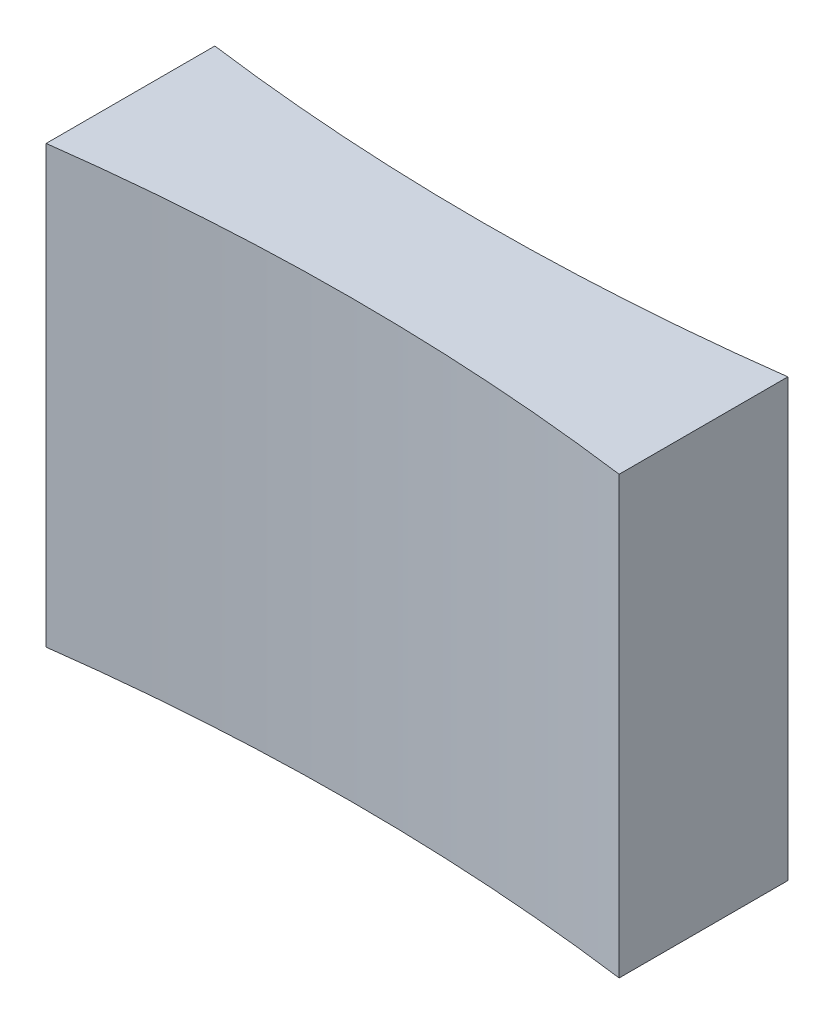
ISO-10303-21;
HEADER;
FILE_DESCRIPTION(('STEP AP214'),'2;1');
FILE_NAME('part.step','',(''),(''),'','','');
FILE_SCHEMA(('AUTOMOTIVE_DESIGN { 1 0 10303 214 1 1 1 1 }'));
ENDSEC;
DATA;
#1=APPLICATION_CONTEXT('core data for automotive mechanical design processes');
#2=APPLICATION_PROTOCOL_DEFINITION('international standard','automotive_design',2000,#1);
#3=PRODUCT_CONTEXT('',#1,'mechanical');
#4=PRODUCT('Part','Part','',(#3));
#5=PRODUCT_RELATED_PRODUCT_CATEGORY('part','',(#4));
#6=PRODUCT_DEFINITION_FORMATION('','',#4);
#7=PRODUCT_DEFINITION_CONTEXT('part definition',#1,'design');
#8=PRODUCT_DEFINITION('design','',#6,#7);
#9=PRODUCT_DEFINITION_SHAPE('','',#8);
#10=(LENGTH_UNIT() NAMED_UNIT(*) SI_UNIT(.MILLI.,.METRE.));
#11=(NAMED_UNIT(*) PLANE_ANGLE_UNIT() SI_UNIT($,.RADIAN.));
#12=(NAMED_UNIT(*) SI_UNIT($,.STERADIAN.) SOLID_ANGLE_UNIT());
#13=UNCERTAINTY_MEASURE_WITH_UNIT(LENGTH_MEASURE(1.E-05),#10,'distance_accuracy_value','');
#14=(GEOMETRIC_REPRESENTATION_CONTEXT(3) GLOBAL_UNCERTAINTY_ASSIGNED_CONTEXT((#13)) GLOBAL_UNIT_ASSIGNED_CONTEXT((#10,
#11,#12)) REPRESENTATION_CONTEXT('',''));
#15=CARTESIAN_POINT('',(0.,0.,0.));
#16=DIRECTION('',(0.,0.,1.));
#17=DIRECTION('',(1.,0.,0.));
#18=AXIS2_PLACEMENT_3D('',#15,#16,#17);
#19=CARTESIAN_POINT('',(-1.66533453693773E-13,9.,-102.907430787315));
#20=DIRECTION('',(0.,-1.,0.));
#21=DIRECTION('',(0.,0.,-1.));
#22=AXIS2_PLACEMENT_3D('',#19,#20,#21);
#23=CYLINDRICAL_SURFACE('',#22,99.9074307873154);
#24=CARTESIAN_POINT('',(-1.66533453693773E-13,0.,-102.907430787315));
#25=DIRECTION('',(0.,1.,0.));
#26=DIRECTION('',(0.,0.,1.));
#27=AXIS2_PLACEMENT_3D('',#24,#25,#26);
#28=CIRCLE('',#27,99.9074307873154);
#29=CARTESIAN_POINT('',(-13.1344064930465,0.,-3.86712539300816));
#30=VERTEX_POINT('',#29);
#31=CARTESIAN_POINT('',(13.1344064930464,0.,-3.86712539300819));
#32=VERTEX_POINT('',#31);
#33=EDGE_CURVE('E178',#30,#32,#28,.T.);
#34=ORIENTED_EDGE('',*,*,#33,.F.);
#35=DIRECTION('',(0.,-1.,0.));
#36=VECTOR('',#35,1.);
#37=CARTESIAN_POINT('',(-13.1344064930465,9.,-3.86712539300816));
#38=LINE('',#37,#36);
#39=CARTESIAN_POINT('',(-13.1344064930465,20.,-3.86712539300816));
#40=VERTEX_POINT('',#39);
#41=EDGE_CURVE('E11',#40,#30,#38,.T.);
#42=ORIENTED_EDGE('',*,*,#41,.F.);
#43=CARTESIAN_POINT('',(-1.66533453693773E-13,20.,-102.907430787315));
#44=DIRECTION('',(0.,1.,0.));
#45=DIRECTION('',(0.,0.,1.));
#46=AXIS2_PLACEMENT_3D('',#43,#44,#45);
#47=CIRCLE('',#46,99.9074307873154);
#48=CARTESIAN_POINT('',(13.1344064930464,20.,-3.86712539300819));
#49=VERTEX_POINT('',#48);
#50=EDGE_CURVE('E166',#49,#40,#47,.F.);
#51=ORIENTED_EDGE('',*,*,#50,.F.);
#52=DIRECTION('',(0.,-1.,0.));
#53=VECTOR('',#52,1.);
#54=CARTESIAN_POINT('',(13.1344064930464,9.,-3.86712539300819));
#55=LINE('',#54,#53);
#56=EDGE_CURVE('E70',#49,#32,#55,.T.);
#57=ORIENTED_EDGE('',*,*,#56,.T.);
#58=EDGE_LOOP('',(#34,#42,#51,#57));
#59=FACE_BOUND('',#58,.T.);
#60=ADVANCED_FACE('F47',(#59),#23,.F.);
#61=CARTESIAN_POINT('',(-13.1344064930464,9.,1.73809884253372E-13));
#62=DIRECTION('',(1.,0.,0.));
#63=DIRECTION('',(0.,0.,-1.));
#64=AXIS2_PLACEMENT_3D('',#61,#62,#63);
#65=PLANE('',#64);
#66=DIRECTION('',(0.,0.,1.));
#67=VECTOR('',#66,1.);
#68=CARTESIAN_POINT('',(-13.1344064930464,0.,1.73809884253372E-13));
#69=LINE('',#68,#67);
#70=CARTESIAN_POINT('',(-13.1344064930464,0.,3.86712539300834));
#71=VERTEX_POINT('',#70);
#72=EDGE_CURVE('E182',#30,#71,#69,.T.);
#73=ORIENTED_EDGE('',*,*,#72,.T.);
#74=DIRECTION('',(0.,-1.,0.));
#75=VECTOR('',#74,1.);
#76=CARTESIAN_POINT('',(-13.1344064930464,9.,3.86712539300834));
#77=LINE('',#76,#75);
#78=CARTESIAN_POINT('',(-13.1344064930464,20.,3.86712539300835));
#79=VERTEX_POINT('',#78);
#80=EDGE_CURVE('E55',#79,#71,#77,.T.);
#81=ORIENTED_EDGE('',*,*,#80,.F.);
#82=DIRECTION('',(0.,0.,1.));
#83=VECTOR('',#82,1.);
#84=CARTESIAN_POINT('',(-13.1344064930464,20.,1.73809884253372E-13));
#85=LINE('',#84,#83);
#86=EDGE_CURVE('E170',#40,#79,#85,.T.);
#87=ORIENTED_EDGE('',*,*,#86,.F.);
#88=ORIENTED_EDGE('',*,*,#41,.T.);
#89=EDGE_LOOP('',(#73,#81,#87,#88));
#90=FACE_BOUND('',#89,.T.);
#91=ADVANCED_FACE('F205',(#90),#65,.F.);
#92=CARTESIAN_POINT('',(-1.31838984174237E-13,9.,102.907430787315));
#93=DIRECTION('',(0.,-1.,0.));
#94=DIRECTION('',(0.,0.,-1.));
#95=AXIS2_PLACEMENT_3D('',#92,#93,#94);
#96=CYLINDRICAL_SURFACE('',#95,99.9074307873151);
#97=CARTESIAN_POINT('',(-1.31838984174237E-13,0.,102.907430787315));
#98=DIRECTION('',(0.,1.,0.));
#99=DIRECTION('',(0.,0.,1.));
#100=AXIS2_PLACEMENT_3D('',#97,#98,#99);
#101=CIRCLE('',#100,99.9074307873151);
#102=CARTESIAN_POINT('',(13.1344064930462,0.,3.86712539300835));
#103=VERTEX_POINT('',#102);
#104=EDGE_CURVE('E186',#103,#71,#101,.T.);
#105=ORIENTED_EDGE('',*,*,#104,.F.);
#106=DIRECTION('',(0.,-1.,0.));
#107=VECTOR('',#106,1.);
#108=CARTESIAN_POINT('',(13.1344064930462,9.,3.86712539300835));
#109=LINE('',#108,#107);
#110=CARTESIAN_POINT('',(13.1344064930462,20.,3.86712539300835));
#111=VERTEX_POINT('',#110);
#112=EDGE_CURVE('E195',#111,#103,#109,.T.);
#113=ORIENTED_EDGE('',*,*,#112,.F.);
#114=CARTESIAN_POINT('',(-1.31838984174237E-13,20.,102.907430787315));
#115=DIRECTION('',(0.,1.,0.));
#116=DIRECTION('',(0.,0.,1.));
#117=AXIS2_PLACEMENT_3D('',#114,#115,#116);
#118=CIRCLE('',#117,99.9074307873151);
#119=EDGE_CURVE('E174',#79,#111,#118,.F.);
#120=ORIENTED_EDGE('',*,*,#119,.F.);
#121=ORIENTED_EDGE('',*,*,#80,.T.);
#122=EDGE_LOOP('',(#105,#113,#120,#121));
#123=FACE_BOUND('',#122,.T.);
#124=ADVANCED_FACE('F201',(#123),#96,.F.);
#125=CARTESIAN_POINT('',(13.1344064930463,9.,2.71025582225593E-13));
#126=DIRECTION('',(-1.,0.,0.));
#127=DIRECTION('',(0.,0.,1.));
#128=AXIS2_PLACEMENT_3D('',#125,#126,#127);
#129=PLANE('',#128);
#130=DIRECTION('',(0.,0.,-1.));
#131=VECTOR('',#130,1.);
#132=CARTESIAN_POINT('',(13.1344064930463,0.,2.71025582225593E-13));
#133=LINE('',#132,#131);
#134=EDGE_CURVE('E190',#103,#32,#133,.T.);
#135=ORIENTED_EDGE('',*,*,#134,.T.);
#136=ORIENTED_EDGE('',*,*,#56,.F.);
#137=DIRECTION('',(0.,0.,-1.));
#138=VECTOR('',#137,1.);
#139=CARTESIAN_POINT('',(13.1344064930463,20.,2.71025582225593E-13));
#140=LINE('',#139,#138);
#141=EDGE_CURVE('E157',#111,#49,#140,.T.);
#142=ORIENTED_EDGE('',*,*,#141,.F.);
#143=ORIENTED_EDGE('',*,*,#112,.T.);
#144=EDGE_LOOP('',(#135,#136,#142,#143));
#145=FACE_BOUND('',#144,.T.);
#146=ADVANCED_FACE('F210',(#145),#129,.F.);
#147=CARTESIAN_POINT('',(0.,0.,0.));
#148=DIRECTION('',(0.,1.,0.));
#149=DIRECTION('',(0.,0.,1.));
#150=AXIS2_PLACEMENT_3D('',#147,#148,#149);
#151=PLANE('',#150);
#152=DIRECTION('',(1.,0.,0.));
#153=VECTOR('',#152,1.);
#154=CARTESIAN_POINT('',(-7.5,0.,-2.5));
#155=LINE('',#154,#153);
#156=CARTESIAN_POINT('',(-7.5,0.,-2.5));
#157=VERTEX_POINT('',#156);
#158=CARTESIAN_POINT('',(7.5,0.,-2.5));
#159=VERTEX_POINT('',#158);
#160=EDGE_CURVE('E148',#157,#159,#155,.T.);
#161=ORIENTED_EDGE('',*,*,#160,.F.);
#162=DIRECTION('',(0.,0.,-1.));
#163=VECTOR('',#162,1.);
#164=CARTESIAN_POINT('',(-7.5,0.,2.5));
#165=LINE('',#164,#163);
#166=CARTESIAN_POINT('',(-7.5,0.,2.5));
#167=VERTEX_POINT('',#166);
#168=EDGE_CURVE('E62',#167,#157,#165,.T.);
#169=ORIENTED_EDGE('',*,*,#168,.F.);
#170=DIRECTION('',(-1.,0.,0.));
#171=VECTOR('',#170,1.);
#172=CARTESIAN_POINT('',(-7.5,0.,2.5));
#173=LINE('',#172,#171);
#174=CARTESIAN_POINT('',(7.5,0.,2.5));
#175=VERTEX_POINT('',#174);
#176=EDGE_CURVE('E135',#175,#167,#173,.T.);
#177=ORIENTED_EDGE('',*,*,#176,.F.);
#178=DIRECTION('',(0.,0.,1.));
#179=VECTOR('',#178,1.);
#180=CARTESIAN_POINT('',(7.5,0.,2.5));
#181=LINE('',#180,#179);
#182=EDGE_CURVE('E139',#159,#175,#181,.T.);
#183=ORIENTED_EDGE('',*,*,#182,.F.);
#184=EDGE_LOOP('',(#161,#169,#177,#183));
#185=FACE_BOUND('',#184,.T.);
#186=ORIENTED_EDGE('',*,*,#33,.T.);
#187=ORIENTED_EDGE('',*,*,#134,.F.);
#188=ORIENTED_EDGE('',*,*,#104,.T.);
#189=ORIENTED_EDGE('',*,*,#72,.F.);
#190=EDGE_LOOP('',(#186,#187,#188,#189));
#191=FACE_BOUND('',#190,.T.);
#192=ADVANCED_FACE('F208',(#185,#191),#151,.F.);
#193=CARTESIAN_POINT('',(0.,20.,0.));
#194=DIRECTION('',(0.,1.,0.));
#195=DIRECTION('',(0.,0.,1.));
#196=AXIS2_PLACEMENT_3D('',#193,#194,#195);
#197=PLANE('',#196);
#198=ORIENTED_EDGE('',*,*,#141,.T.);
#199=ORIENTED_EDGE('',*,*,#50,.T.);
#200=ORIENTED_EDGE('',*,*,#86,.T.);
#201=ORIENTED_EDGE('',*,*,#119,.T.);
#202=EDGE_LOOP('',(#198,#199,#200,#201));
#203=FACE_BOUND('',#202,.T.);
#204=ADVANCED_FACE('F213',(#203),#197,.T.);
#205=CARTESIAN_POINT('',(-7.5,3.,2.5));
#206=DIRECTION('',(-1.,0.,0.));
#207=DIRECTION('',(0.,0.,1.));
#208=AXIS2_PLACEMENT_3D('',#205,#206,#207);
#209=PLANE('',#208);
#210=ORIENTED_EDGE('',*,*,#168,.T.);
#211=DIRECTION('',(0.,-1.,0.));
#212=VECTOR('',#211,1.);
#213=CARTESIAN_POINT('',(-7.5,3.,-2.5));
#214=LINE('',#213,#212);
#215=CARTESIAN_POINT('',(-7.5,3.,-2.5));
#216=VERTEX_POINT('',#215);
#217=EDGE_CURVE('E110',#216,#157,#214,.T.);
#218=ORIENTED_EDGE('',*,*,#217,.F.);
#219=DIRECTION('',(0.,0.,-1.));
#220=VECTOR('',#219,1.);
#221=CARTESIAN_POINT('',(-7.5,3.,2.5));
#222=LINE('',#221,#220);
#223=CARTESIAN_POINT('',(-7.5,3.,2.5));
#224=VERTEX_POINT('',#223);
#225=EDGE_CURVE('E114',#224,#216,#222,.T.);
#226=ORIENTED_EDGE('',*,*,#225,.F.);
#227=DIRECTION('',(0.,-1.,0.));
#228=VECTOR('',#227,1.);
#229=CARTESIAN_POINT('',(-7.5,3.,2.5));
#230=LINE('',#229,#228);
#231=EDGE_CURVE('E154',#224,#167,#230,.T.);
#232=ORIENTED_EDGE('',*,*,#231,.T.);
#233=EDGE_LOOP('',(#210,#218,#226,#232));
#234=FACE_BOUND('',#233,.T.);
#235=ADVANCED_FACE('F112',(#234),#209,.F.);
#236=CARTESIAN_POINT('',(-7.5,3.,2.5));
#237=DIRECTION('',(0.,0.,1.));
#238=DIRECTION('',(1.,0.,0.));
#239=AXIS2_PLACEMENT_3D('',#236,#237,#238);
#240=PLANE('',#239);
#241=ORIENTED_EDGE('',*,*,#176,.T.);
#242=ORIENTED_EDGE('',*,*,#231,.F.);
#243=DIRECTION('',(-1.,0.,0.));
#244=VECTOR('',#243,1.);
#245=CARTESIAN_POINT('',(-7.5,3.,2.5));
#246=LINE('',#245,#244);
#247=CARTESIAN_POINT('',(7.5,3.,2.5));
#248=VERTEX_POINT('',#247);
#249=EDGE_CURVE('E121',#248,#224,#246,.T.);
#250=ORIENTED_EDGE('',*,*,#249,.F.);
#251=DIRECTION('',(0.,-1.,0.));
#252=VECTOR('',#251,1.);
#253=CARTESIAN_POINT('',(7.5,3.,2.5));
#254=LINE('',#253,#252);
#255=EDGE_CURVE('E158',#248,#175,#254,.T.);
#256=ORIENTED_EDGE('',*,*,#255,.T.);
#257=EDGE_LOOP('',(#241,#242,#250,#256));
#258=FACE_BOUND('',#257,.T.);
#259=ADVANCED_FACE('F232',(#258),#240,.F.);
#260=CARTESIAN_POINT('',(7.5,3.,2.5));
#261=DIRECTION('',(1.,0.,0.));
#262=DIRECTION('',(0.,0.,-1.));
#263=AXIS2_PLACEMENT_3D('',#260,#261,#262);
#264=PLANE('',#263);
#265=ORIENTED_EDGE('',*,*,#182,.T.);
#266=ORIENTED_EDGE('',*,*,#255,.F.);
#267=DIRECTION('',(0.,0.,1.));
#268=VECTOR('',#267,1.);
#269=CARTESIAN_POINT('',(7.5,3.,2.5));
#270=LINE('',#269,#268);
#271=CARTESIAN_POINT('',(7.5,3.,-2.5));
#272=VERTEX_POINT('',#271);
#273=EDGE_CURVE('E130',#272,#248,#270,.T.);
#274=ORIENTED_EDGE('',*,*,#273,.F.);
#275=DIRECTION('',(0.,-1.,0.));
#276=VECTOR('',#275,1.);
#277=CARTESIAN_POINT('',(7.5,3.,-2.5));
#278=LINE('',#277,#276);
#279=EDGE_CURVE('E120',#272,#159,#278,.T.);
#280=ORIENTED_EDGE('',*,*,#279,.T.);
#281=EDGE_LOOP('',(#265,#266,#274,#280));
#282=FACE_BOUND('',#281,.T.);
#283=ADVANCED_FACE('F235',(#282),#264,.F.);
#284=CARTESIAN_POINT('',(-7.5,3.,-2.5));
#285=DIRECTION('',(0.,0.,-1.));
#286=DIRECTION('',(-1.,0.,0.));
#287=AXIS2_PLACEMENT_3D('',#284,#285,#286);
#288=PLANE('',#287);
#289=ORIENTED_EDGE('',*,*,#160,.T.);
#290=ORIENTED_EDGE('',*,*,#279,.F.);
#291=DIRECTION('',(1.,0.,0.));
#292=VECTOR('',#291,1.);
#293=CARTESIAN_POINT('',(-7.5,3.,-2.5));
#294=LINE('',#293,#292);
#295=EDGE_CURVE('E124',#216,#272,#294,.T.);
#296=ORIENTED_EDGE('',*,*,#295,.F.);
#297=ORIENTED_EDGE('',*,*,#217,.T.);
#298=EDGE_LOOP('',(#289,#290,#296,#297));
#299=FACE_BOUND('',#298,.T.);
#300=ADVANCED_FACE('F125',(#299),#288,.F.);
#301=CARTESIAN_POINT('',(0.,3.,0.));
#302=DIRECTION('',(0.,-1.,0.));
#303=DIRECTION('',(0.,0.,-1.));
#304=AXIS2_PLACEMENT_3D('',#301,#302,#303);
#305=PLANE('',#304);
#306=ORIENTED_EDGE('',*,*,#225,.T.);
#307=ORIENTED_EDGE('',*,*,#295,.T.);
#308=ORIENTED_EDGE('',*,*,#273,.T.);
#309=ORIENTED_EDGE('',*,*,#249,.T.);
#310=EDGE_LOOP('',(#306,#307,#308,#309));
#311=FACE_BOUND('',#310,.T.);
#312=ADVANCED_FACE('F132',(#311),#305,.T.);
#313=CLOSED_SHELL('',(#60,#91,#124,#146,#192,#204,#235,#259,#283,#300,#312));
#314=MANIFOLD_SOLID_BREP('B2',#313);
#315=ADVANCED_BREP_SHAPE_REPRESENTATION('',(#18,#314),#14);
#316=SHAPE_DEFINITION_REPRESENTATION(#9,#315);
ENDSEC;
END-ISO-10303-21;
